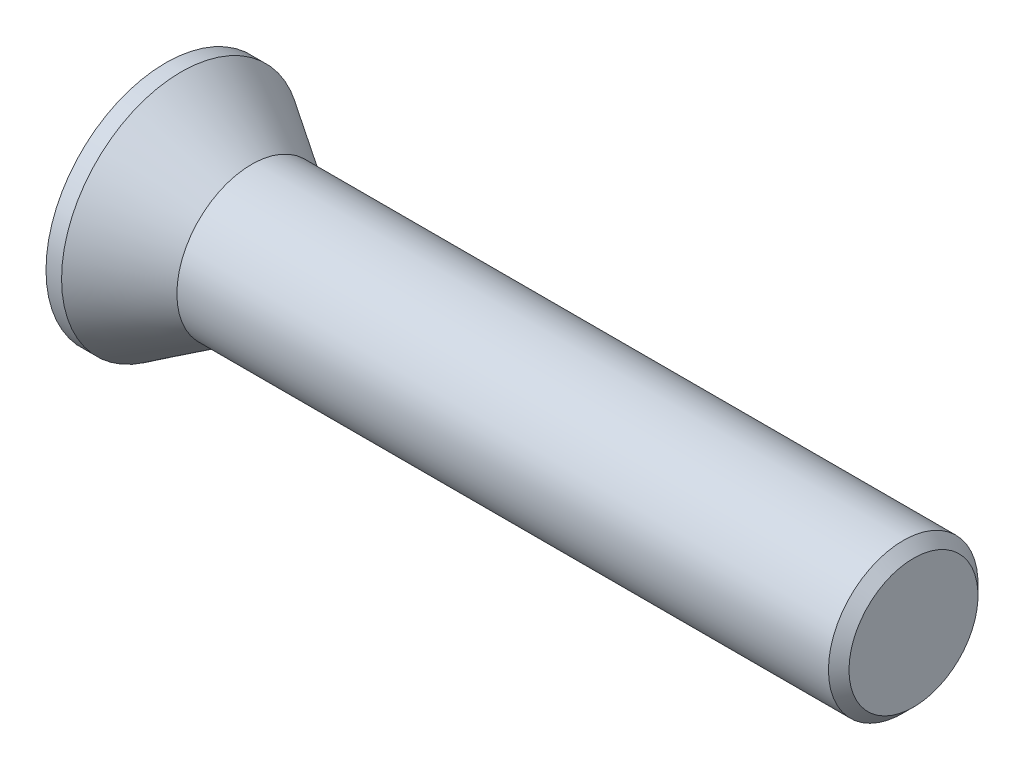
ISO-10303-21;
HEADER;
FILE_DESCRIPTION(('STEP AP214'),'2;1');
FILE_NAME('part.step','',(''),(''),'','','');
FILE_SCHEMA(('AUTOMOTIVE_DESIGN { 1 0 10303 214 1 1 1 1 }'));
ENDSEC;
DATA;
#1=APPLICATION_CONTEXT('core data for automotive mechanical design processes');
#2=APPLICATION_PROTOCOL_DEFINITION('international standard','automotive_design',2000,#1);
#3=PRODUCT_CONTEXT('',#1,'mechanical');
#4=PRODUCT('Part','Part','',(#3));
#5=PRODUCT_RELATED_PRODUCT_CATEGORY('part','',(#4));
#6=PRODUCT_DEFINITION_FORMATION('','',#4);
#7=PRODUCT_DEFINITION_CONTEXT('part definition',#1,'design');
#8=PRODUCT_DEFINITION('design','',#6,#7);
#9=PRODUCT_DEFINITION_SHAPE('','',#8);
#10=(LENGTH_UNIT() NAMED_UNIT(*) SI_UNIT(.MILLI.,.METRE.));
#11=(NAMED_UNIT(*) PLANE_ANGLE_UNIT() SI_UNIT($,.RADIAN.));
#12=(NAMED_UNIT(*) SI_UNIT($,.STERADIAN.) SOLID_ANGLE_UNIT());
#13=UNCERTAINTY_MEASURE_WITH_UNIT(LENGTH_MEASURE(1.E-05),#10,'distance_accuracy_value','');
#14=(GEOMETRIC_REPRESENTATION_CONTEXT(3) GLOBAL_UNCERTAINTY_ASSIGNED_CONTEXT((#13)) GLOBAL_UNIT_ASSIGNED_CONTEXT((#10,
#11,#12)) REPRESENTATION_CONTEXT('',''));
#15=CARTESIAN_POINT('',(0.,0.,0.));
#16=DIRECTION('',(0.,0.,1.));
#17=DIRECTION('',(1.,0.,0.));
#18=AXIS2_PLACEMENT_3D('',#15,#16,#17);
#19=CARTESIAN_POINT('',(0.,0.,0.));
#20=DIRECTION('',(-1.,0.,0.));
#21=DIRECTION('',(0.,0.,1.));
#22=AXIS2_PLACEMENT_3D('',#19,#20,#21);
#23=PLANE('',#22);
#24=CARTESIAN_POINT('',(0.,0.,0.));
#25=DIRECTION('',(-1.,0.,0.));
#26=DIRECTION('',(0.,0.,1.));
#27=AXIS2_PLACEMENT_3D('',#24,#25,#26);
#28=CIRCLE('',#27,16.);
#29=CARTESIAN_POINT('',(0.,0.,16.));
#30=VERTEX_POINT('',#29);
#31=EDGE_CURVE('E11',#30,#30,#28,.T.);
#32=ORIENTED_EDGE('',*,*,#31,.T.);
#33=EDGE_LOOP('',(#32));
#34=FACE_BOUND('',#33,.T.);
#35=DIRECTION('',(0.,1.,0.));
#36=VECTOR('',#35,1.);
#37=CARTESIAN_POINT('',(0.,-2.5,12.5));
#38=LINE('',#37,#36);
#39=CARTESIAN_POINT('',(0.,-2.5,12.5));
#40=VERTEX_POINT('',#39);
#41=CARTESIAN_POINT('',(0.,2.5,12.5));
#42=VERTEX_POINT('',#41);
#43=EDGE_CURVE('E84',#40,#42,#38,.T.);
#44=ORIENTED_EDGE('',*,*,#43,.F.);
#45=DIRECTION('',(0.,0.,1.));
#46=VECTOR('',#45,1.);
#47=CARTESIAN_POINT('',(0.,-2.5,-12.5));
#48=LINE('',#47,#46);
#49=CARTESIAN_POINT('',(0.,-2.5,-12.5));
#50=VERTEX_POINT('',#49);
#51=EDGE_CURVE('E94',#50,#40,#48,.T.);
#52=ORIENTED_EDGE('',*,*,#51,.F.);
#53=DIRECTION('',(0.,1.,0.));
#54=VECTOR('',#53,1.);
#55=CARTESIAN_POINT('',(0.,-2.5,-12.5));
#56=LINE('',#55,#54);
#57=CARTESIAN_POINT('',(0.,2.5,-12.5));
#58=VERTEX_POINT('',#57);
#59=EDGE_CURVE('E54',#50,#58,#56,.T.);
#60=ORIENTED_EDGE('',*,*,#59,.T.);
#61=DIRECTION('',(0.,0.,1.));
#62=VECTOR('',#61,1.);
#63=CARTESIAN_POINT('',(0.,2.5,-12.5));
#64=LINE('',#63,#62);
#65=EDGE_CURVE('E89',#58,#42,#64,.T.);
#66=ORIENTED_EDGE('',*,*,#65,.T.);
#67=EDGE_LOOP('',(#44,#52,#60,#66));
#68=FACE_BOUND('',#67,.T.);
#69=ADVANCED_FACE('F32',(#34,#68),#23,.T.);
#70=CARTESIAN_POINT('',(0.,0.,0.));
#71=DIRECTION('',(-1.,0.,0.));
#72=DIRECTION('',(0.,0.,1.));
#73=AXIS2_PLACEMENT_3D('',#70,#71,#72);
#74=CYLINDRICAL_SURFACE('',#73,16.);
#75=CARTESIAN_POINT('',(2.08188653729509,0.,0.));
#76=DIRECTION('',(-1.,0.,0.));
#77=DIRECTION('',(0.,0.,1.));
#78=AXIS2_PLACEMENT_3D('',#75,#76,#77);
#79=CIRCLE('',#78,16.);
#80=CARTESIAN_POINT('',(2.08188653729509,0.,16.));
#81=VERTEX_POINT('',#80);
#82=EDGE_CURVE('E39',#81,#81,#79,.T.);
#83=ORIENTED_EDGE('',*,*,#82,.T.);
#84=EDGE_LOOP('',(#83));
#85=FACE_BOUND('',#84,.T.);
#86=ORIENTED_EDGE('',*,*,#31,.F.);
#87=EDGE_LOOP('',(#86));
#88=FACE_BOUND('',#87,.T.);
#89=ADVANCED_FACE('F119',(#85,#88),#74,.T.);
#90=CARTESIAN_POINT('',(2.08188653729509,0.,0.));
#91=DIRECTION('',(-1.,0.,0.));
#92=DIRECTION('',(0.,0.,1.));
#93=AXIS2_PLACEMENT_3D('',#90,#91,#92);
#94=CONICAL_SURFACE('',#93,16.,0.567232006898159);
#95=CARTESIAN_POINT('',(11.5,0.,0.));
#96=DIRECTION('',(-1.,0.,0.));
#97=DIRECTION('',(0.,0.,1.));
#98=AXIS2_PLACEMENT_3D('',#95,#96,#97);
#99=CIRCLE('',#98,10.);
#100=CARTESIAN_POINT('',(11.5,0.,10.));
#101=VERTEX_POINT('',#100);
#102=EDGE_CURVE('E114',#101,#101,#99,.T.);
#103=ORIENTED_EDGE('',*,*,#102,.T.);
#104=EDGE_LOOP('',(#103));
#105=FACE_BOUND('',#104,.T.);
#106=ORIENTED_EDGE('',*,*,#82,.F.);
#107=EDGE_LOOP('',(#106));
#108=FACE_BOUND('',#107,.T.);
#109=ADVANCED_FACE('F122',(#105,#108),#94,.T.);
#110=CARTESIAN_POINT('',(0.,0.,0.));
#111=DIRECTION('',(-1.,0.,0.));
#112=DIRECTION('',(0.,0.,1.));
#113=AXIS2_PLACEMENT_3D('',#110,#111,#112);
#114=CYLINDRICAL_SURFACE('',#113,10.);
#115=CARTESIAN_POINT('',(98.6259999999993,0.,0.));
#116=DIRECTION('',(-1.,0.,0.));
#117=DIRECTION('',(0.,0.,1.));
#118=AXIS2_PLACEMENT_3D('',#115,#116,#117);
#119=CIRCLE('',#118,10.);
#120=CARTESIAN_POINT('',(98.6259999999993,0.,10.));
#121=VERTEX_POINT('',#120);
#122=EDGE_CURVE('E111',#121,#121,#119,.T.);
#123=ORIENTED_EDGE('',*,*,#122,.T.);
#124=EDGE_LOOP('',(#123));
#125=FACE_BOUND('',#124,.T.);
#126=ORIENTED_EDGE('',*,*,#102,.F.);
#127=EDGE_LOOP('',(#126));
#128=FACE_BOUND('',#127,.T.);
#129=ADVANCED_FACE('F124',(#125,#128),#114,.T.);
#130=CARTESIAN_POINT('',(100.,0.,0.));
#131=DIRECTION('',(-1.,0.,0.));
#132=DIRECTION('',(0.,0.,1.));
#133=AXIS2_PLACEMENT_3D('',#130,#131,#132);
#134=CONICAL_SURFACE('',#133,8.626,0.785398163397196);
#135=ORIENTED_EDGE('',*,*,#122,.F.);
#136=EDGE_LOOP('',(#135));
#137=FACE_BOUND('',#136,.T.);
#138=CARTESIAN_POINT('',(100.,0.,0.));
#139=DIRECTION('',(-1.,0.,0.));
#140=DIRECTION('',(0.,0.,1.));
#141=AXIS2_PLACEMENT_3D('',#138,#139,#140);
#142=CIRCLE('',#141,8.626);
#143=CARTESIAN_POINT('',(100.,0.,8.626));
#144=VERTEX_POINT('',#143);
#145=EDGE_CURVE('E106',#144,#144,#142,.T.);
#146=ORIENTED_EDGE('',*,*,#145,.T.);
#147=EDGE_LOOP('',(#146));
#148=FACE_BOUND('',#147,.T.);
#149=ADVANCED_FACE('F131',(#137,#148),#134,.T.);
#150=CARTESIAN_POINT('',(100.,8.626,0.));
#151=DIRECTION('',(1.,0.,0.));
#152=DIRECTION('',(0.,0.,-1.));
#153=AXIS2_PLACEMENT_3D('',#150,#151,#152);
#154=PLANE('',#153);
#155=ORIENTED_EDGE('',*,*,#145,.F.);
#156=EDGE_LOOP('',(#155));
#157=FACE_BOUND('',#156,.T.);
#158=ADVANCED_FACE('F145',(#157),#154,.T.);
#159=CARTESIAN_POINT('',(0.,-2.5,-12.5));
#160=DIRECTION('',(0.537299608346825,0.,-0.843391445812885));
#161=DIRECTION('',(-0.843391445812885,0.,-0.537299608346825));
#162=AXIS2_PLACEMENT_3D('',#159,#160,#161);
#163=PLANE('',#162);
#164=ORIENTED_EDGE('',*,*,#59,.F.);
#165=DIRECTION('',(-0.843391445812885,0.,-0.537299608346825));
#166=VECTOR('',#165,1.);
#167=CARTESIAN_POINT('',(0.,-2.5,-12.5));
#168=LINE('',#167,#166);
#169=CARTESIAN_POINT('',(4.,-2.5,-9.95171895677002));
#170=VERTEX_POINT('',#169);
#171=EDGE_CURVE('E103',#170,#50,#168,.T.);
#172=ORIENTED_EDGE('',*,*,#171,.F.);
#173=DIRECTION('',(0.,1.,0.));
#174=VECTOR('',#173,1.);
#175=CARTESIAN_POINT('',(4.,-2.5,-9.95171895677002));
#176=LINE('',#175,#174);
#177=CARTESIAN_POINT('',(4.,2.5,-9.95171895677002));
#178=VERTEX_POINT('',#177);
#179=EDGE_CURVE('E83',#170,#178,#176,.T.);
#180=ORIENTED_EDGE('',*,*,#179,.T.);
#181=DIRECTION('',(-0.843391445812885,0.,-0.537299608346825));
#182=VECTOR('',#181,1.);
#183=CARTESIAN_POINT('',(0.,2.5,-12.5));
#184=LINE('',#183,#182);
#185=EDGE_CURVE('E92',#178,#58,#184,.T.);
#186=ORIENTED_EDGE('',*,*,#185,.T.);
#187=EDGE_LOOP('',(#164,#172,#180,#186));
#188=FACE_BOUND('',#187,.T.);
#189=ADVANCED_FACE('F143',(#188),#163,.F.);
#190=CARTESIAN_POINT('',(4.,-2.5,-9.95171895677002));
#191=DIRECTION('',(1.,0.,0.));
#192=DIRECTION('',(0.,0.,-1.));
#193=AXIS2_PLACEMENT_3D('',#190,#191,#192);
#194=PLANE('',#193);
#195=ORIENTED_EDGE('',*,*,#179,.F.);
#196=DIRECTION('',(0.,0.,-1.));
#197=VECTOR('',#196,1.);
#198=CARTESIAN_POINT('',(4.,-2.5,-9.95171895677002));
#199=LINE('',#198,#197);
#200=CARTESIAN_POINT('',(4.,-2.5,9.95171895677002));
#201=VERTEX_POINT('',#200);
#202=EDGE_CURVE('E80',#201,#170,#199,.T.);
#203=ORIENTED_EDGE('',*,*,#202,.F.);
#204=DIRECTION('',(0.,1.,0.));
#205=VECTOR('',#204,1.);
#206=CARTESIAN_POINT('',(4.,-2.5,9.95171895677002));
#207=LINE('',#206,#205);
#208=CARTESIAN_POINT('',(4.,2.5,9.95171895677002));
#209=VERTEX_POINT('',#208);
#210=EDGE_CURVE('E75',#201,#209,#207,.T.);
#211=ORIENTED_EDGE('',*,*,#210,.T.);
#212=DIRECTION('',(0.,0.,-1.));
#213=VECTOR('',#212,1.);
#214=CARTESIAN_POINT('',(4.,2.5,-9.95171895677002));
#215=LINE('',#214,#213);
#216=EDGE_CURVE('E77',#209,#178,#215,.T.);
#217=ORIENTED_EDGE('',*,*,#216,.T.);
#218=EDGE_LOOP('',(#195,#203,#211,#217));
#219=FACE_BOUND('',#218,.T.);
#220=ADVANCED_FACE('F76',(#219),#194,.F.);
#221=CARTESIAN_POINT('',(0.,-2.5,12.5));
#222=DIRECTION('',(0.537299608346825,0.,0.843391445812885));
#223=DIRECTION('',(0.843391445812885,0.,-0.537299608346825));
#224=AXIS2_PLACEMENT_3D('',#221,#222,#223);
#225=PLANE('',#224);
#226=ORIENTED_EDGE('',*,*,#210,.F.);
#227=DIRECTION('',(0.843391445812885,0.,-0.537299608346825));
#228=VECTOR('',#227,1.);
#229=CARTESIAN_POINT('',(0.,-2.5,12.5));
#230=LINE('',#229,#228);
#231=EDGE_CURVE('E100',#40,#201,#230,.T.);
#232=ORIENTED_EDGE('',*,*,#231,.F.);
#233=ORIENTED_EDGE('',*,*,#43,.T.);
#234=DIRECTION('',(0.843391445812885,0.,-0.537299608346825));
#235=VECTOR('',#234,1.);
#236=CARTESIAN_POINT('',(0.,2.5,12.5));
#237=LINE('',#236,#235);
#238=EDGE_CURVE('E46',#42,#209,#237,.T.);
#239=ORIENTED_EDGE('',*,*,#238,.T.);
#240=EDGE_LOOP('',(#226,#232,#233,#239));
#241=FACE_BOUND('',#240,.T.);
#242=ADVANCED_FACE('F86',(#241),#225,.F.);
#243=CARTESIAN_POINT('',(0.,-2.5,12.5));
#244=DIRECTION('',(0.,1.,0.));
#245=DIRECTION('',(0.,0.,1.));
#246=AXIS2_PLACEMENT_3D('',#243,#244,#245);
#247=PLANE('',#246);
#248=ORIENTED_EDGE('',*,*,#51,.T.);
#249=ORIENTED_EDGE('',*,*,#231,.T.);
#250=ORIENTED_EDGE('',*,*,#202,.T.);
#251=ORIENTED_EDGE('',*,*,#171,.T.);
#252=EDGE_LOOP('',(#248,#249,#250,#251));
#253=FACE_BOUND('',#252,.T.);
#254=ADVANCED_FACE('F142',(#253),#247,.T.);
#255=CARTESIAN_POINT('',(0.,2.5,12.5));
#256=DIRECTION('',(0.,1.,0.));
#257=DIRECTION('',(0.,0.,1.));
#258=AXIS2_PLACEMENT_3D('',#255,#256,#257);
#259=PLANE('',#258);
#260=ORIENTED_EDGE('',*,*,#65,.F.);
#261=ORIENTED_EDGE('',*,*,#185,.F.);
#262=ORIENTED_EDGE('',*,*,#216,.F.);
#263=ORIENTED_EDGE('',*,*,#238,.F.);
#264=EDGE_LOOP('',(#260,#261,#262,#263));
#265=FACE_BOUND('',#264,.T.);
#266=ADVANCED_FACE('F91',(#265),#259,.F.);
#267=CLOSED_SHELL('',(#69,#89,#109,#129,#149,#158,#189,#220,#242,#254,#266));
#268=MANIFOLD_SOLID_BREP('B2',#267);
#269=ADVANCED_BREP_SHAPE_REPRESENTATION('',(#18,#268),#14);
#270=SHAPE_DEFINITION_REPRESENTATION(#9,#269);
ENDSEC;
END-ISO-10303-21;
